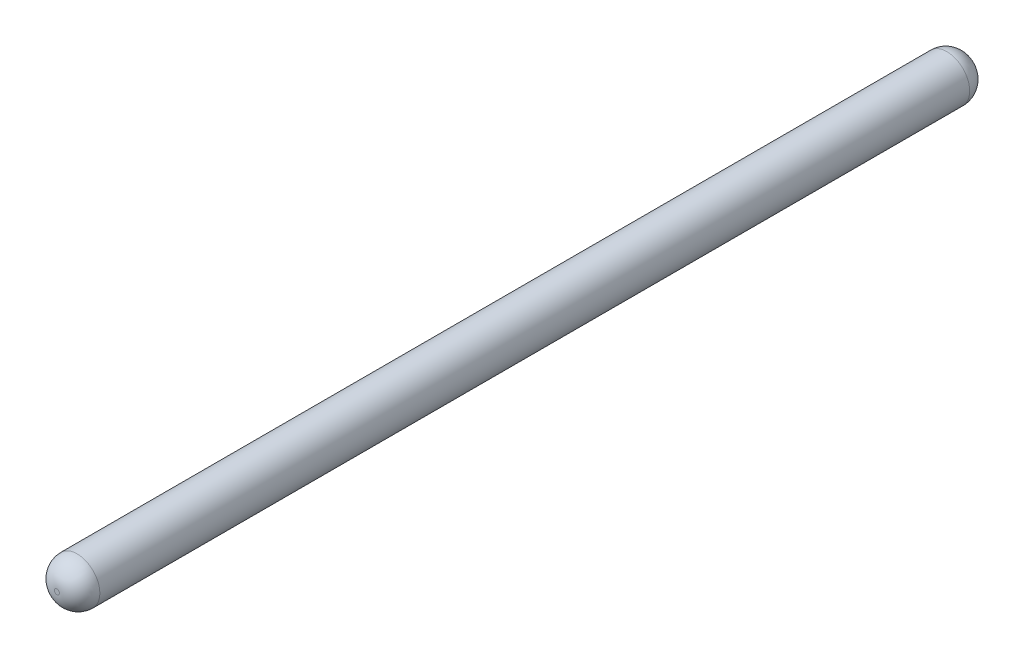
ISO-10303-21;
HEADER;
FILE_DESCRIPTION(('STEP AP214'),'2;1');
FILE_NAME('part.step','',(''),(''),'','','');
FILE_SCHEMA(('AUTOMOTIVE_DESIGN { 1 0 10303 214 1 1 1 1 }'));
ENDSEC;
DATA;
#1=APPLICATION_CONTEXT('core data for automotive mechanical design processes');
#2=APPLICATION_PROTOCOL_DEFINITION('international standard','automotive_design',2000,#1);
#3=PRODUCT_CONTEXT('',#1,'mechanical');
#4=PRODUCT('Part','Part','',(#3));
#5=PRODUCT_RELATED_PRODUCT_CATEGORY('part','',(#4));
#6=PRODUCT_DEFINITION_FORMATION('','',#4);
#7=PRODUCT_DEFINITION_CONTEXT('part definition',#1,'design');
#8=PRODUCT_DEFINITION('design','',#6,#7);
#9=PRODUCT_DEFINITION_SHAPE('','',#8);
#10=(LENGTH_UNIT() NAMED_UNIT(*) SI_UNIT(.MILLI.,.METRE.));
#11=(NAMED_UNIT(*) PLANE_ANGLE_UNIT() SI_UNIT($,.RADIAN.));
#12=(NAMED_UNIT(*) SI_UNIT($,.STERADIAN.) SOLID_ANGLE_UNIT());
#13=UNCERTAINTY_MEASURE_WITH_UNIT(LENGTH_MEASURE(1.E-05),#10,'distance_accuracy_value','');
#14=(GEOMETRIC_REPRESENTATION_CONTEXT(3) GLOBAL_UNCERTAINTY_ASSIGNED_CONTEXT((#13)) GLOBAL_UNIT_ASSIGNED_CONTEXT((#10,
#11,#12)) REPRESENTATION_CONTEXT('',''));
#15=CARTESIAN_POINT('',(0.,0.,0.));
#16=DIRECTION('',(0.,0.,1.));
#17=DIRECTION('',(1.,0.,0.));
#18=AXIS2_PLACEMENT_3D('',#15,#16,#17);
#19=CARTESIAN_POINT('',(0.,0.,36.));
#20=DIRECTION('',(0.,0.,-1.));
#21=DIRECTION('',(-1.,0.,0.));
#22=AXIS2_PLACEMENT_3D('',#19,#20,#21);
#23=CYLINDRICAL_SURFACE('',#22,0.9);
#24=CARTESIAN_POINT('',(0.,0.,0.800000000000002));
#25=DIRECTION('',(0.,0.,1.));
#26=DIRECTION('',(1.,0.,0.));
#27=AXIS2_PLACEMENT_3D('',#24,#25,#26);
#28=CIRCLE('',#27,0.9);
#29=CARTESIAN_POINT('',(0.9,0.,0.800000000000002));
#30=VERTEX_POINT('',#29);
#31=EDGE_CURVE('E43',#30,#30,#28,.T.);
#32=ORIENTED_EDGE('',*,*,#31,.T.);
#33=EDGE_LOOP('',(#32));
#34=FACE_BOUND('',#33,.T.);
#35=CARTESIAN_POINT('',(0.,0.,35.2));
#36=DIRECTION('',(0.,0.,1.));
#37=DIRECTION('',(1.,0.,0.));
#38=AXIS2_PLACEMENT_3D('',#35,#36,#37);
#39=CIRCLE('',#38,0.9);
#40=CARTESIAN_POINT('',(0.9,0.,35.2));
#41=VERTEX_POINT('',#40);
#42=EDGE_CURVE('E47',#41,#41,#39,.F.);
#43=ORIENTED_EDGE('',*,*,#42,.T.);
#44=EDGE_LOOP('',(#43));
#45=FACE_BOUND('',#44,.T.);
#46=ADVANCED_FACE('F32',(#34,#45),#23,.T.);
#47=CARTESIAN_POINT('',(0.,0.,36.));
#48=DIRECTION('',(0.,0.,1.));
#49=DIRECTION('',(1.,0.,0.));
#50=AXIS2_PLACEMENT_3D('',#47,#48,#49);
#51=PLANE('',#50);
#52=CARTESIAN_POINT('',(0.,0.,36.));
#53=DIRECTION('',(0.,0.,1.));
#54=DIRECTION('',(1.,0.,0.));
#55=AXIS2_PLACEMENT_3D('',#52,#53,#54);
#56=CIRCLE('',#55,0.0999999999999999);
#57=CARTESIAN_POINT('',(0.0999999999999999,0.,36.));
#58=VERTEX_POINT('',#57);
#59=EDGE_CURVE('E10',#58,#58,#56,.T.);
#60=ORIENTED_EDGE('',*,*,#59,.T.);
#61=EDGE_LOOP('',(#60));
#62=FACE_BOUND('',#61,.T.);
#63=ADVANCED_FACE('F63',(#62),#51,.T.);
#64=CARTESIAN_POINT('',(0.,0.,0.));
#65=DIRECTION('',(0.,0.,1.));
#66=DIRECTION('',(1.,0.,0.));
#67=AXIS2_PLACEMENT_3D('',#64,#65,#66);
#68=PLANE('',#67);
#69=CARTESIAN_POINT('',(0.,0.,0.));
#70=DIRECTION('',(0.,0.,1.));
#71=DIRECTION('',(1.,0.,0.));
#72=AXIS2_PLACEMENT_3D('',#69,#70,#71);
#73=CIRCLE('',#72,0.0999999999999999);
#74=CARTESIAN_POINT('',(0.0999999999999999,0.,0.));
#75=VERTEX_POINT('',#74);
#76=EDGE_CURVE('E39',#75,#75,#73,.F.);
#77=ORIENTED_EDGE('',*,*,#76,.T.);
#78=EDGE_LOOP('',(#77));
#79=FACE_BOUND('',#78,.T.);
#80=ADVANCED_FACE('F60',(#79),#68,.F.);
#81=CARTESIAN_POINT('',(0.,0.,0.800000000000002));
#82=DIRECTION('',(0.,0.,1.));
#83=DIRECTION('',(1.,0.,0.));
#84=AXIS2_PLACEMENT_3D('',#81,#82,#83);
#85=DEGENERATE_TOROIDAL_SURFACE('',#84,0.0999999999999999,0.8,.T.);
#86=ORIENTED_EDGE('',*,*,#76,.F.);
#87=EDGE_LOOP('',(#86));
#88=FACE_BOUND('',#87,.T.);
#89=ORIENTED_EDGE('',*,*,#31,.F.);
#90=EDGE_LOOP('',(#89));
#91=FACE_BOUND('',#90,.T.);
#92=ADVANCED_FACE('F56',(#88,#91),#85,.T.);
#93=CARTESIAN_POINT('',(0.,0.,35.2));
#94=DIRECTION('',(0.,0.,1.));
#95=DIRECTION('',(1.,0.,0.));
#96=AXIS2_PLACEMENT_3D('',#93,#94,#95);
#97=DEGENERATE_TOROIDAL_SURFACE('',#96,0.0999999999999999,0.8,.T.);
#98=ORIENTED_EDGE('',*,*,#42,.F.);
#99=EDGE_LOOP('',(#98));
#100=FACE_BOUND('',#99,.T.);
#101=ORIENTED_EDGE('',*,*,#59,.F.);
#102=EDGE_LOOP('',(#101));
#103=FACE_BOUND('',#102,.T.);
#104=ADVANCED_FACE('F34',(#100,#103),#97,.T.);
#105=CLOSED_SHELL('',(#46,#63,#80,#92,#104));
#106=MANIFOLD_SOLID_BREP('B2',#105);
#107=ADVANCED_BREP_SHAPE_REPRESENTATION('',(#18,#106),#14);
#108=SHAPE_DEFINITION_REPRESENTATION(#9,#107);
ENDSEC;
END-ISO-10303-21;
